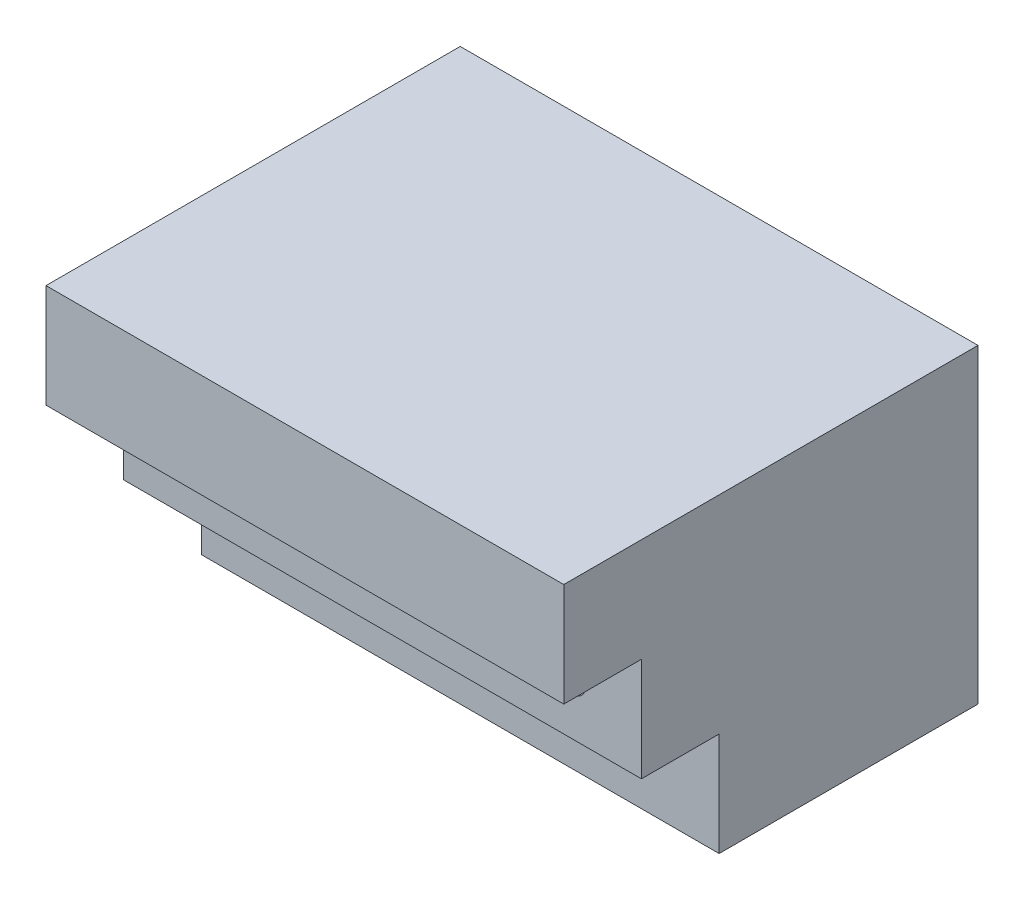
ISO-10303-21;
HEADER;
FILE_DESCRIPTION(('STEP AP214'),'2;1');
FILE_NAME('part.step','',(''),(''),'','','');
FILE_SCHEMA(('AUTOMOTIVE_DESIGN { 1 0 10303 214 1 1 1 1 }'));
ENDSEC;
DATA;
#1=APPLICATION_CONTEXT('core data for automotive mechanical design processes');
#2=APPLICATION_PROTOCOL_DEFINITION('international standard','automotive_design',2000,#1);
#3=PRODUCT_CONTEXT('',#1,'mechanical');
#4=PRODUCT('Part','Part','',(#3));
#5=PRODUCT_RELATED_PRODUCT_CATEGORY('part','',(#4));
#6=PRODUCT_DEFINITION_FORMATION('','',#4);
#7=PRODUCT_DEFINITION_CONTEXT('part definition',#1,'design');
#8=PRODUCT_DEFINITION('design','',#6,#7);
#9=PRODUCT_DEFINITION_SHAPE('','',#8);
#10=(LENGTH_UNIT() NAMED_UNIT(*) SI_UNIT(.MILLI.,.METRE.));
#11=(NAMED_UNIT(*) PLANE_ANGLE_UNIT() SI_UNIT($,.RADIAN.));
#12=(NAMED_UNIT(*) SI_UNIT($,.STERADIAN.) SOLID_ANGLE_UNIT());
#13=UNCERTAINTY_MEASURE_WITH_UNIT(LENGTH_MEASURE(1.E-05),#10,'distance_accuracy_value','');
#14=(GEOMETRIC_REPRESENTATION_CONTEXT(3) GLOBAL_UNCERTAINTY_ASSIGNED_CONTEXT((#13)) GLOBAL_UNIT_ASSIGNED_CONTEXT((#10,
#11,#12)) REPRESENTATION_CONTEXT('',''));
#15=CARTESIAN_POINT('',(0.,0.,0.));
#16=DIRECTION('',(0.,0.,1.));
#17=DIRECTION('',(1.,0.,0.));
#18=AXIS2_PLACEMENT_3D('',#15,#16,#17);
#19=CARTESIAN_POINT('',(0.,0.,100.));
#20=DIRECTION('',(0.,1.,0.));
#21=DIRECTION('',(0.,0.,1.));
#22=AXIS2_PLACEMENT_3D('',#19,#20,#21);
#23=PLANE('',#22);
#24=DIRECTION('',(1.,0.,0.));
#25=VECTOR('',#24,1.);
#26=CARTESIAN_POINT('',(0.,0.,0.));
#27=LINE('',#26,#25);
#28=CARTESIAN_POINT('',(0.,0.,0.));
#29=VERTEX_POINT('',#28);
#30=CARTESIAN_POINT('',(200.,0.,0.));
#31=VERTEX_POINT('',#30);
#32=EDGE_CURVE('E103',#29,#31,#27,.T.);
#33=ORIENTED_EDGE('',*,*,#32,.T.);
#34=DIRECTION('',(0.,0.,-1.));
#35=VECTOR('',#34,1.);
#36=CARTESIAN_POINT('',(200.,0.,100.));
#37=LINE('',#36,#35);
#38=CARTESIAN_POINT('',(200.,0.,100.));
#39=VERTEX_POINT('',#38);
#40=EDGE_CURVE('E12',#39,#31,#37,.T.);
#41=ORIENTED_EDGE('',*,*,#40,.F.);
#42=DIRECTION('',(1.,0.,0.));
#43=VECTOR('',#42,1.);
#44=CARTESIAN_POINT('',(0.,0.,100.));
#45=LINE('',#44,#43);
#46=CARTESIAN_POINT('',(0.,0.,100.));
#47=VERTEX_POINT('',#46);
#48=EDGE_CURVE('E95',#47,#39,#45,.T.);
#49=ORIENTED_EDGE('',*,*,#48,.F.);
#50=DIRECTION('',(0.,0.,-1.));
#51=VECTOR('',#50,1.);
#52=CARTESIAN_POINT('',(0.,0.,100.));
#53=LINE('',#52,#51);
#54=EDGE_CURVE('E53',#47,#29,#53,.T.);
#55=ORIENTED_EDGE('',*,*,#54,.T.);
#56=EDGE_LOOP('',(#33,#41,#49,#55));
#57=FACE_BOUND('',#56,.T.);
#58=ADVANCED_FACE('F45',(#57),#23,.F.);
#59=CARTESIAN_POINT('',(200.,0.,100.));
#60=DIRECTION('',(-1.,0.,0.));
#61=DIRECTION('',(0.,0.,1.));
#62=AXIS2_PLACEMENT_3D('',#59,#60,#61);
#63=PLANE('',#62);
#64=DIRECTION('',(0.,1.,0.));
#65=VECTOR('',#64,1.);
#66=CARTESIAN_POINT('',(200.,0.,0.));
#67=LINE('',#66,#65);
#68=CARTESIAN_POINT('',(200.,120.,0.));
#69=VERTEX_POINT('',#68);
#70=EDGE_CURVE('E73',#31,#69,#67,.T.);
#71=ORIENTED_EDGE('',*,*,#70,.T.);
#72=DIRECTION('',(0.,0.,-1.));
#73=VECTOR('',#72,1.);
#74=CARTESIAN_POINT('',(200.,120.,160.));
#75=LINE('',#74,#73);
#76=CARTESIAN_POINT('',(200.,120.,160.));
#77=VERTEX_POINT('',#76);
#78=EDGE_CURVE('E132',#77,#69,#75,.T.);
#79=ORIENTED_EDGE('',*,*,#78,.F.);
#80=DIRECTION('',(0.,-1.,0.));
#81=VECTOR('',#80,1.);
#82=CARTESIAN_POINT('',(200.,80.,160.));
#83=LINE('',#82,#81);
#84=CARTESIAN_POINT('',(200.,80.,160.));
#85=VERTEX_POINT('',#84);
#86=EDGE_CURVE('E147',#77,#85,#83,.T.);
#87=ORIENTED_EDGE('',*,*,#86,.T.);
#88=DIRECTION('',(0.,0.,-1.));
#89=VECTOR('',#88,1.);
#90=CARTESIAN_POINT('',(200.,80.,160.));
#91=LINE('',#90,#89);
#92=CARTESIAN_POINT('',(200.,80.,130.));
#93=VERTEX_POINT('',#92);
#94=EDGE_CURVE('E136',#85,#93,#91,.T.);
#95=ORIENTED_EDGE('',*,*,#94,.T.);
#96=DIRECTION('',(0.,1.,0.));
#97=VECTOR('',#96,1.);
#98=CARTESIAN_POINT('',(200.,0.,130.));
#99=LINE('',#98,#97);
#100=CARTESIAN_POINT('',(200.,40.,130.));
#101=VERTEX_POINT('',#100);
#102=EDGE_CURVE('E122',#101,#93,#99,.T.);
#103=ORIENTED_EDGE('',*,*,#102,.F.);
#104=DIRECTION('',(0.,0.,-1.));
#105=VECTOR('',#104,1.);
#106=CARTESIAN_POINT('',(200.,40.,130.));
#107=LINE('',#106,#105);
#108=CARTESIAN_POINT('',(200.,40.,100.));
#109=VERTEX_POINT('',#108);
#110=EDGE_CURVE('E93',#101,#109,#107,.T.);
#111=ORIENTED_EDGE('',*,*,#110,.T.);
#112=DIRECTION('',(0.,1.,0.));
#113=VECTOR('',#112,1.);
#114=CARTESIAN_POINT('',(200.,0.,100.));
#115=LINE('',#114,#113);
#116=EDGE_CURVE('E80',#39,#109,#115,.T.);
#117=ORIENTED_EDGE('',*,*,#116,.F.);
#118=ORIENTED_EDGE('',*,*,#40,.T.);
#119=EDGE_LOOP('',(#71,#79,#87,#95,#103,#111,#117,#118));
#120=FACE_BOUND('',#119,.T.);
#121=ADVANCED_FACE('F88',(#120),#63,.F.);
#122=CARTESIAN_POINT('',(0.,0.,100.));
#123=DIRECTION('',(-1.,0.,0.));
#124=DIRECTION('',(0.,0.,1.));
#125=AXIS2_PLACEMENT_3D('',#122,#123,#124);
#126=PLANE('',#125);
#127=DIRECTION('',(0.,1.,0.));
#128=VECTOR('',#127,1.);
#129=CARTESIAN_POINT('',(0.,0.,0.));
#130=LINE('',#129,#128);
#131=CARTESIAN_POINT('',(0.,120.,0.));
#132=VERTEX_POINT('',#131);
#133=EDGE_CURVE('E101',#29,#132,#130,.T.);
#134=ORIENTED_EDGE('',*,*,#133,.F.);
#135=ORIENTED_EDGE('',*,*,#54,.F.);
#136=DIRECTION('',(0.,1.,0.));
#137=VECTOR('',#136,1.);
#138=CARTESIAN_POINT('',(0.,0.,100.));
#139=LINE('',#138,#137);
#140=CARTESIAN_POINT('',(0.,40.,100.));
#141=VERTEX_POINT('',#140);
#142=EDGE_CURVE('E99',#47,#141,#139,.T.);
#143=ORIENTED_EDGE('',*,*,#142,.T.);
#144=DIRECTION('',(0.,0.,-1.));
#145=VECTOR('',#144,1.);
#146=CARTESIAN_POINT('',(0.,40.,130.));
#147=LINE('',#146,#145);
#148=CARTESIAN_POINT('',(0.,40.,130.));
#149=VERTEX_POINT('',#148);
#150=EDGE_CURVE('E107',#149,#141,#147,.T.);
#151=ORIENTED_EDGE('',*,*,#150,.F.);
#152=DIRECTION('',(0.,1.,0.));
#153=VECTOR('',#152,1.);
#154=CARTESIAN_POINT('',(0.,0.,130.));
#155=LINE('',#154,#153);
#156=CARTESIAN_POINT('',(0.,80.,130.));
#157=VERTEX_POINT('',#156);
#158=EDGE_CURVE('E116',#149,#157,#155,.T.);
#159=ORIENTED_EDGE('',*,*,#158,.T.);
#160=DIRECTION('',(0.,0.,-1.));
#161=VECTOR('',#160,1.);
#162=CARTESIAN_POINT('',(0.,80.,160.));
#163=LINE('',#162,#161);
#164=CARTESIAN_POINT('',(0.,80.,160.));
#165=VERTEX_POINT('',#164);
#166=EDGE_CURVE('E128',#165,#157,#163,.T.);
#167=ORIENTED_EDGE('',*,*,#166,.F.);
#168=DIRECTION('',(0.,1.,0.));
#169=VECTOR('',#168,1.);
#170=CARTESIAN_POINT('',(0.,80.,160.));
#171=LINE('',#170,#169);
#172=CARTESIAN_POINT('',(0.,120.,160.));
#173=VERTEX_POINT('',#172);
#174=EDGE_CURVE('E143',#165,#173,#171,.T.);
#175=ORIENTED_EDGE('',*,*,#174,.T.);
#176=DIRECTION('',(0.,0.,-1.));
#177=VECTOR('',#176,1.);
#178=CARTESIAN_POINT('',(0.,120.,160.));
#179=LINE('',#178,#177);
#180=EDGE_CURVE('E129',#173,#132,#179,.T.);
#181=ORIENTED_EDGE('',*,*,#180,.T.);
#182=EDGE_LOOP('',(#134,#135,#143,#151,#159,#167,#175,#181));
#183=FACE_BOUND('',#182,.T.);
#184=ADVANCED_FACE('F220',(#183),#126,.T.);
#185=CARTESIAN_POINT('',(0.,0.,100.));
#186=DIRECTION('',(0.,0.,1.));
#187=DIRECTION('',(1.,0.,0.));
#188=AXIS2_PLACEMENT_3D('',#185,#186,#187);
#189=PLANE('',#188);
#190=ORIENTED_EDGE('',*,*,#48,.T.);
#191=ORIENTED_EDGE('',*,*,#116,.T.);
#192=DIRECTION('',(1.,0.,0.));
#193=VECTOR('',#192,1.);
#194=CARTESIAN_POINT('',(0.,40.,100.));
#195=LINE('',#194,#193);
#196=EDGE_CURVE('E94',#141,#109,#195,.T.);
#197=ORIENTED_EDGE('',*,*,#196,.F.);
#198=ORIENTED_EDGE('',*,*,#142,.F.);
#199=EDGE_LOOP('',(#190,#191,#197,#198));
#200=FACE_BOUND('',#199,.T.);
#201=ADVANCED_FACE('F98',(#200),#189,.T.);
#202=CARTESIAN_POINT('',(0.,0.,0.));
#203=DIRECTION('',(0.,0.,1.));
#204=DIRECTION('',(1.,0.,0.));
#205=AXIS2_PLACEMENT_3D('',#202,#203,#204);
#206=PLANE('',#205);
#207=ORIENTED_EDGE('',*,*,#32,.F.);
#208=ORIENTED_EDGE('',*,*,#133,.T.);
#209=DIRECTION('',(1.,0.,0.));
#210=VECTOR('',#209,1.);
#211=CARTESIAN_POINT('',(0.,120.,0.));
#212=LINE('',#211,#210);
#213=EDGE_CURVE('E141',#132,#69,#212,.T.);
#214=ORIENTED_EDGE('',*,*,#213,.T.);
#215=ORIENTED_EDGE('',*,*,#70,.F.);
#216=EDGE_LOOP('',(#207,#208,#214,#215));
#217=FACE_BOUND('',#216,.T.);
#218=ADVANCED_FACE('F209',(#217),#206,.F.);
#219=CARTESIAN_POINT('',(0.,40.,130.));
#220=DIRECTION('',(0.,1.,0.));
#221=DIRECTION('',(0.,0.,1.));
#222=AXIS2_PLACEMENT_3D('',#219,#220,#221);
#223=PLANE('',#222);
#224=ORIENTED_EDGE('',*,*,#150,.T.);
#225=ORIENTED_EDGE('',*,*,#196,.T.);
#226=ORIENTED_EDGE('',*,*,#110,.F.);
#227=DIRECTION('',(1.,0.,0.));
#228=VECTOR('',#227,1.);
#229=CARTESIAN_POINT('',(0.,40.,130.));
#230=LINE('',#229,#228);
#231=EDGE_CURVE('E125',#149,#101,#230,.T.);
#232=ORIENTED_EDGE('',*,*,#231,.F.);
#233=EDGE_LOOP('',(#224,#225,#226,#232));
#234=FACE_BOUND('',#233,.T.);
#235=ADVANCED_FACE('F192',(#234),#223,.F.);
#236=CARTESIAN_POINT('',(0.,0.,130.));
#237=DIRECTION('',(0.,0.,1.));
#238=DIRECTION('',(1.,0.,0.));
#239=AXIS2_PLACEMENT_3D('',#236,#237,#238);
#240=PLANE('',#239);
#241=CARTESIAN_POINT('',(173.42575674013,60.,130.));
#242=DIRECTION('',(0.,0.,1.));
#243=DIRECTION('',(1.,0.,0.));
#244=AXIS2_PLACEMENT_3D('',#241,#242,#243);
#245=CIRCLE('',#244,4.99999999999999);
#246=CARTESIAN_POINT('',(178.42575674013,60.,130.));
#247=VERTEX_POINT('',#246);
#248=EDGE_CURVE('E182',#247,#247,#245,.T.);
#249=ORIENTED_EDGE('',*,*,#248,.F.);
#250=EDGE_LOOP('',(#249));
#251=FACE_BOUND('',#250,.T.);
#252=CARTESIAN_POINT('',(137.238261218442,60.,130.));
#253=DIRECTION('',(0.,0.,1.));
#254=DIRECTION('',(1.,0.,0.));
#255=AXIS2_PLACEMENT_3D('',#252,#253,#254);
#256=CIRCLE('',#255,4.99999999999999);
#257=CARTESIAN_POINT('',(142.238261218442,60.,130.));
#258=VERTEX_POINT('',#257);
#259=EDGE_CURVE('E176',#258,#258,#256,.T.);
#260=ORIENTED_EDGE('',*,*,#259,.F.);
#261=EDGE_LOOP('',(#260));
#262=FACE_BOUND('',#261,.T.);
#263=CARTESIAN_POINT('',(100.,60.,130.));
#264=DIRECTION('',(0.,0.,1.));
#265=DIRECTION('',(1.,0.,0.));
#266=AXIS2_PLACEMENT_3D('',#263,#264,#265);
#267=CIRCLE('',#266,5.00000000000001);
#268=CARTESIAN_POINT('',(105.,60.,130.));
#269=VERTEX_POINT('',#268);
#270=EDGE_CURVE('E170',#269,#269,#267,.T.);
#271=ORIENTED_EDGE('',*,*,#270,.F.);
#272=EDGE_LOOP('',(#271));
#273=FACE_BOUND('',#272,.T.);
#274=CARTESIAN_POINT('',(60.7404924127195,60.,130.));
#275=DIRECTION('',(0.,0.,1.));
#276=DIRECTION('',(1.,0.,0.));
#277=AXIS2_PLACEMENT_3D('',#274,#275,#276);
#278=CIRCLE('',#277,5.00000000000001);
#279=CARTESIAN_POINT('',(65.7404924127195,60.,130.));
#280=VERTEX_POINT('',#279);
#281=EDGE_CURVE('E163',#280,#280,#278,.T.);
#282=ORIENTED_EDGE('',*,*,#281,.F.);
#283=EDGE_LOOP('',(#282));
#284=FACE_BOUND('',#283,.T.);
#285=CARTESIAN_POINT('',(24.2204977443521,60.,130.));
#286=DIRECTION('',(0.,0.,1.));
#287=DIRECTION('',(1.,0.,0.));
#288=AXIS2_PLACEMENT_3D('',#285,#286,#287);
#289=CIRCLE('',#288,5.);
#290=CARTESIAN_POINT('',(29.2204977443521,60.,130.));
#291=VERTEX_POINT('',#290);
#292=EDGE_CURVE('E157',#291,#291,#289,.T.);
#293=ORIENTED_EDGE('',*,*,#292,.F.);
#294=EDGE_LOOP('',(#293));
#295=FACE_BOUND('',#294,.T.);
#296=ORIENTED_EDGE('',*,*,#231,.T.);
#297=ORIENTED_EDGE('',*,*,#102,.T.);
#298=DIRECTION('',(1.,0.,0.));
#299=VECTOR('',#298,1.);
#300=CARTESIAN_POINT('',(0.,80.,130.));
#301=LINE('',#300,#299);
#302=EDGE_CURVE('E119',#157,#93,#301,.T.);
#303=ORIENTED_EDGE('',*,*,#302,.F.);
#304=ORIENTED_EDGE('',*,*,#158,.F.);
#305=EDGE_LOOP('',(#296,#297,#303,#304));
#306=FACE_BOUND('',#305,.T.);
#307=ADVANCED_FACE('F188',(#251,#262,#273,#284,#295,#306),#240,.T.);
#308=CARTESIAN_POINT('',(0.,80.,160.));
#309=DIRECTION('',(0.,-1.,0.));
#310=DIRECTION('',(0.,0.,-1.));
#311=AXIS2_PLACEMENT_3D('',#308,#309,#310);
#312=PLANE('',#311);
#313=ORIENTED_EDGE('',*,*,#166,.T.);
#314=ORIENTED_EDGE('',*,*,#302,.T.);
#315=ORIENTED_EDGE('',*,*,#94,.F.);
#316=DIRECTION('',(-1.,0.,0.));
#317=VECTOR('',#316,1.);
#318=CARTESIAN_POINT('',(0.,80.,160.));
#319=LINE('',#318,#317);
#320=EDGE_CURVE('E133',#85,#165,#319,.T.);
#321=ORIENTED_EDGE('',*,*,#320,.T.);
#322=EDGE_LOOP('',(#313,#314,#315,#321));
#323=FACE_BOUND('',#322,.T.);
#324=ADVANCED_FACE('F191',(#323),#312,.T.);
#325=CARTESIAN_POINT('',(0.,120.,160.));
#326=DIRECTION('',(0.,1.,0.));
#327=DIRECTION('',(-1.,0.,0.));
#328=AXIS2_PLACEMENT_3D('',#325,#326,#327);
#329=PLANE('',#328);
#330=ORIENTED_EDGE('',*,*,#213,.F.);
#331=ORIENTED_EDGE('',*,*,#180,.F.);
#332=DIRECTION('',(1.,0.,0.));
#333=VECTOR('',#332,1.);
#334=CARTESIAN_POINT('',(0.,120.,160.));
#335=LINE('',#334,#333);
#336=EDGE_CURVE('E150',#173,#77,#335,.T.);
#337=ORIENTED_EDGE('',*,*,#336,.T.);
#338=ORIENTED_EDGE('',*,*,#78,.T.);
#339=EDGE_LOOP('',(#330,#331,#337,#338));
#340=FACE_BOUND('',#339,.T.);
#341=ADVANCED_FACE('F246',(#340),#329,.T.);
#342=CARTESIAN_POINT('',(0.,0.,160.));
#343=DIRECTION('',(0.,0.,-1.));
#344=DIRECTION('',(-1.,0.,0.));
#345=AXIS2_PLACEMENT_3D('',#342,#343,#344);
#346=PLANE('',#345);
#347=ORIENTED_EDGE('',*,*,#174,.F.);
#348=ORIENTED_EDGE('',*,*,#320,.F.);
#349=ORIENTED_EDGE('',*,*,#86,.F.);
#350=ORIENTED_EDGE('',*,*,#336,.F.);
#351=EDGE_LOOP('',(#347,#348,#349,#350));
#352=FACE_BOUND('',#351,.T.);
#353=ADVANCED_FACE('F256',(#352),#346,.F.);
#354=CARTESIAN_POINT('',(24.2204977443521,60.,130.));
#355=DIRECTION('',(0.,0.,1.));
#356=DIRECTION('',(1.,0.,0.));
#357=AXIS2_PLACEMENT_3D('',#354,#355,#356);
#358=CONICAL_SURFACE('',#357,5.,0.0174532925199433);
#359=CARTESIAN_POINT('',(24.2204977443521,60.,80.));
#360=DIRECTION('',(0.,0.,1.));
#361=DIRECTION('',(1.,0.,0.));
#362=AXIS2_PLACEMENT_3D('',#359,#360,#361);
#363=CIRCLE('',#362,4.12724675358912);
#364=CARTESIAN_POINT('',(28.3477444979412,60.,80.));
#365=VERTEX_POINT('',#364);
#366=EDGE_CURVE('E144',#365,#365,#363,.T.);
#367=ORIENTED_EDGE('',*,*,#366,.F.);
#368=EDGE_LOOP('',(#367));
#369=FACE_BOUND('',#368,.T.);
#370=ORIENTED_EDGE('',*,*,#292,.T.);
#371=EDGE_LOOP('',(#370));
#372=FACE_BOUND('',#371,.T.);
#373=ADVANCED_FACE('F266',(#369,#372),#358,.F.);
#374=CARTESIAN_POINT('',(24.2204977443521,60.,80.));
#375=DIRECTION('',(0.,0.,1.));
#376=DIRECTION('',(1.,0.,0.));
#377=AXIS2_PLACEMENT_3D('',#374,#375,#376);
#378=PLANE('',#377);
#379=ORIENTED_EDGE('',*,*,#366,.T.);
#380=EDGE_LOOP('',(#379));
#381=FACE_BOUND('',#380,.T.);
#382=ADVANCED_FACE('F277',(#381),#378,.T.);
#383=CARTESIAN_POINT('',(60.7404924127195,60.,130.));
#384=DIRECTION('',(0.,0.,1.));
#385=DIRECTION('',(1.,0.,0.));
#386=AXIS2_PLACEMENT_3D('',#383,#384,#385);
#387=CONICAL_SURFACE('',#386,5.00000000000001,0.0174532925199433);
#388=CARTESIAN_POINT('',(60.7404924127195,60.,85.));
#389=DIRECTION('',(0.,0.,1.));
#390=DIRECTION('',(1.,0.,0.));
#391=AXIS2_PLACEMENT_3D('',#388,#389,#390);
#392=CIRCLE('',#391,4.21452207823021);
#393=CARTESIAN_POINT('',(64.9550144909497,60.,85.));
#394=VERTEX_POINT('',#393);
#395=EDGE_CURVE('E161',#394,#394,#392,.T.);
#396=ORIENTED_EDGE('',*,*,#395,.F.);
#397=EDGE_LOOP('',(#396));
#398=FACE_BOUND('',#397,.T.);
#399=ORIENTED_EDGE('',*,*,#281,.T.);
#400=EDGE_LOOP('',(#399));
#401=FACE_BOUND('',#400,.T.);
#402=ADVANCED_FACE('F288',(#398,#401),#387,.F.);
#403=CARTESIAN_POINT('',(60.7404924127195,60.,85.));
#404=DIRECTION('',(0.,0.,1.));
#405=DIRECTION('',(1.,0.,0.));
#406=AXIS2_PLACEMENT_3D('',#403,#404,#405);
#407=PLANE('',#406);
#408=ORIENTED_EDGE('',*,*,#395,.T.);
#409=EDGE_LOOP('',(#408));
#410=FACE_BOUND('',#409,.T.);
#411=ADVANCED_FACE('F298',(#410),#407,.T.);
#412=CARTESIAN_POINT('',(100.,60.,130.));
#413=DIRECTION('',(0.,0.,1.));
#414=DIRECTION('',(1.,0.,0.));
#415=AXIS2_PLACEMENT_3D('',#412,#413,#414);
#416=CONICAL_SURFACE('',#415,5.00000000000001,0.0174532925199433);
#417=CARTESIAN_POINT('',(100.,60.,90.));
#418=DIRECTION('',(0.,0.,1.));
#419=DIRECTION('',(1.,0.,0.));
#420=AXIS2_PLACEMENT_3D('',#417,#418,#419);
#421=CIRCLE('',#420,4.3017974028713);
#422=CARTESIAN_POINT('',(104.301797402871,60.,90.));
#423=VERTEX_POINT('',#422);
#424=EDGE_CURVE('E167',#423,#423,#421,.T.);
#425=ORIENTED_EDGE('',*,*,#424,.F.);
#426=EDGE_LOOP('',(#425));
#427=FACE_BOUND('',#426,.T.);
#428=ORIENTED_EDGE('',*,*,#270,.T.);
#429=EDGE_LOOP('',(#428));
#430=FACE_BOUND('',#429,.T.);
#431=ADVANCED_FACE('F308',(#427,#430),#416,.F.);
#432=CARTESIAN_POINT('',(100.,60.,90.));
#433=DIRECTION('',(0.,0.,1.));
#434=DIRECTION('',(1.,0.,0.));
#435=AXIS2_PLACEMENT_3D('',#432,#433,#434);
#436=PLANE('',#435);
#437=ORIENTED_EDGE('',*,*,#424,.T.);
#438=EDGE_LOOP('',(#437));
#439=FACE_BOUND('',#438,.T.);
#440=ADVANCED_FACE('F318',(#439),#436,.T.);
#441=CARTESIAN_POINT('',(137.238261218442,60.,130.));
#442=DIRECTION('',(0.,0.,1.));
#443=DIRECTION('',(1.,0.,0.));
#444=AXIS2_PLACEMENT_3D('',#441,#442,#443);
#445=CONICAL_SURFACE('',#444,4.99999999999999,0.0174532925199433);
#446=CARTESIAN_POINT('',(137.238261218442,60.,95.));
#447=DIRECTION('',(0.,0.,1.));
#448=DIRECTION('',(1.,0.,0.));
#449=AXIS2_PLACEMENT_3D('',#446,#447,#448);
#450=CIRCLE('',#449,4.38907272751238);
#451=CARTESIAN_POINT('',(141.627333945955,60.,95.));
#452=VERTEX_POINT('',#451);
#453=EDGE_CURVE('E173',#452,#452,#450,.T.);
#454=ORIENTED_EDGE('',*,*,#453,.F.);
#455=EDGE_LOOP('',(#454));
#456=FACE_BOUND('',#455,.T.);
#457=ORIENTED_EDGE('',*,*,#259,.T.);
#458=EDGE_LOOP('',(#457));
#459=FACE_BOUND('',#458,.T.);
#460=ADVANCED_FACE('F328',(#456,#459),#445,.F.);
#461=CARTESIAN_POINT('',(137.238261218442,60.,95.));
#462=DIRECTION('',(0.,0.,1.));
#463=DIRECTION('',(1.,0.,0.));
#464=AXIS2_PLACEMENT_3D('',#461,#462,#463);
#465=PLANE('',#464);
#466=ORIENTED_EDGE('',*,*,#453,.T.);
#467=EDGE_LOOP('',(#466));
#468=FACE_BOUND('',#467,.T.);
#469=ADVANCED_FACE('F338',(#468),#465,.T.);
#470=CARTESIAN_POINT('',(173.42575674013,60.,130.));
#471=DIRECTION('',(0.,0.,1.));
#472=DIRECTION('',(1.,0.,0.));
#473=AXIS2_PLACEMENT_3D('',#470,#471,#472);
#474=CONICAL_SURFACE('',#473,4.99999999999999,0.0174532925199433);
#475=CARTESIAN_POINT('',(173.42575674013,60.,100.));
#476=DIRECTION('',(0.,0.,1.));
#477=DIRECTION('',(1.,0.,0.));
#478=AXIS2_PLACEMENT_3D('',#475,#476,#477);
#479=CIRCLE('',#478,4.47634805215346);
#480=CARTESIAN_POINT('',(177.902104792284,60.,100.));
#481=VERTEX_POINT('',#480);
#482=EDGE_CURVE('E179',#481,#481,#479,.T.);
#483=ORIENTED_EDGE('',*,*,#482,.F.);
#484=EDGE_LOOP('',(#483));
#485=FACE_BOUND('',#484,.T.);
#486=ORIENTED_EDGE('',*,*,#248,.T.);
#487=EDGE_LOOP('',(#486));
#488=FACE_BOUND('',#487,.T.);
#489=ADVANCED_FACE('F186',(#485,#488),#474,.F.);
#490=CARTESIAN_POINT('',(173.42575674013,60.,100.));
#491=DIRECTION('',(0.,0.,1.));
#492=DIRECTION('',(1.,0.,0.));
#493=AXIS2_PLACEMENT_3D('',#490,#491,#492);
#494=PLANE('',#493);
#495=ORIENTED_EDGE('',*,*,#482,.T.);
#496=EDGE_LOOP('',(#495));
#497=FACE_BOUND('',#496,.T.);
#498=ADVANCED_FACE('F364',(#497),#494,.T.);
#499=CLOSED_SHELL('',(#58,#121,#184,#201,#218,#235,#307,#324,#341,#353,#373,#382,#402,#411,#431,
#440,#460,#469,#489,#498));
#500=MANIFOLD_SOLID_BREP('B2',#499);
#501=ADVANCED_BREP_SHAPE_REPRESENTATION('',(#18,#500),#14);
#502=SHAPE_DEFINITION_REPRESENTATION(#9,#501);
ENDSEC;
END-ISO-10303-21;
